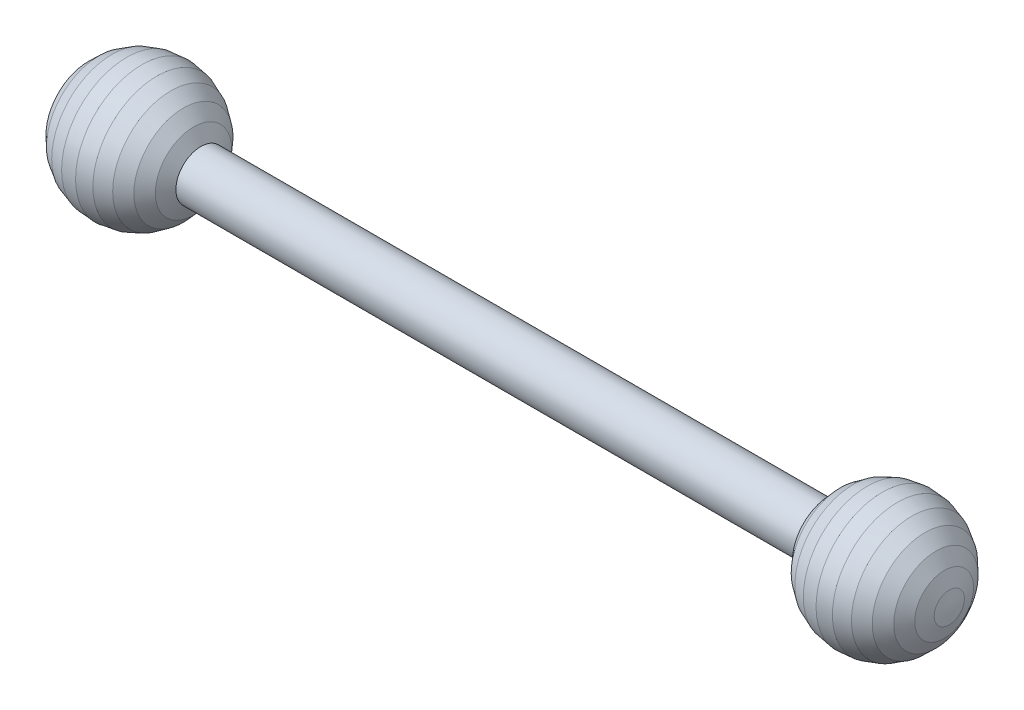
ISO-10303-21;
HEADER;
FILE_DESCRIPTION(('STEP AP214'),'2;1');
FILE_NAME('part.step','',(''),(''),'','','');
FILE_SCHEMA(('AUTOMOTIVE_DESIGN { 1 0 10303 214 1 1 1 1 }'));
ENDSEC;
DATA;
#1=APPLICATION_CONTEXT('core data for automotive mechanical design processes');
#2=APPLICATION_PROTOCOL_DEFINITION('international standard','automotive_design',2000,#1);
#3=PRODUCT_CONTEXT('',#1,'mechanical');
#4=PRODUCT('Part','Part','',(#3));
#5=PRODUCT_RELATED_PRODUCT_CATEGORY('part','',(#4));
#6=PRODUCT_DEFINITION_FORMATION('','',#4);
#7=PRODUCT_DEFINITION_CONTEXT('part definition',#1,'design');
#8=PRODUCT_DEFINITION('design','',#6,#7);
#9=PRODUCT_DEFINITION_SHAPE('','',#8);
#10=(LENGTH_UNIT() NAMED_UNIT(*) SI_UNIT(.MILLI.,.METRE.));
#11=(NAMED_UNIT(*) PLANE_ANGLE_UNIT() SI_UNIT($,.RADIAN.));
#12=(NAMED_UNIT(*) SI_UNIT($,.STERADIAN.) SOLID_ANGLE_UNIT());
#13=UNCERTAINTY_MEASURE_WITH_UNIT(LENGTH_MEASURE(1.E-05),#10,'distance_accuracy_value','');
#14=(GEOMETRIC_REPRESENTATION_CONTEXT(3) GLOBAL_UNCERTAINTY_ASSIGNED_CONTEXT((#13)) GLOBAL_UNIT_ASSIGNED_CONTEXT((#10,
#11,#12)) REPRESENTATION_CONTEXT('',''));
#15=CARTESIAN_POINT('',(0.,0.,0.));
#16=DIRECTION('',(0.,0.,1.));
#17=DIRECTION('',(1.,0.,0.));
#18=AXIS2_PLACEMENT_3D('',#15,#16,#17);
#19=CARTESIAN_POINT('',(-3.89487856586579,0.,0.));
#20=DIRECTION('',(1.,0.,0.));
#21=DIRECTION('',(0.,0.,-1.));
#22=AXIS2_PLACEMENT_3D('',#19,#20,#21);
#23=CONICAL_SURFACE('',#22,0.910999976487176,1.45591316516602);
#24=CARTESIAN_POINT('',(-4.,0.,0.));
#25=VERTEX_POINT('',#24);
#26=VERTEX_LOOP('',#25);
#27=FACE_BOUND('',#26,.T.);
#28=CARTESIAN_POINT('',(-3.89487856586579,0.,0.));
#29=DIRECTION('',(-1.,0.,0.));
#30=DIRECTION('',(0.,0.,1.));
#31=AXIS2_PLACEMENT_3D('',#28,#29,#30);
#32=CIRCLE('',#31,0.910999976487176);
#33=CARTESIAN_POINT('',(-3.89487856586579,0.,0.910999976487176));
#34=VERTEX_POINT('',#33);
#35=EDGE_CURVE('E11',#34,#34,#32,.T.);
#36=ORIENTED_EDGE('',*,*,#35,.T.);
#37=EDGE_LOOP('',(#36));
#38=FACE_BOUND('',#37,.T.);
#39=ADVANCED_FACE('F41',(#27,#38),#23,.T.);
#40=CARTESIAN_POINT('',(-3.5850395214202,0.,0.));
#41=DIRECTION('',(1.,0.,0.));
#42=DIRECTION('',(0.,0.,-1.));
#43=AXIS2_PLACEMENT_3D('',#40,#41,#42);
#44=CONICAL_SURFACE('',#43,1.77411714096205,1.22614684190809);
#45=ORIENTED_EDGE('',*,*,#35,.F.);
#46=EDGE_LOOP('',(#45));
#47=FACE_BOUND('',#46,.T.);
#48=CARTESIAN_POINT('',(-3.5850395214202,0.,0.));
#49=DIRECTION('',(-1.,0.,0.));
#50=DIRECTION('',(0.,0.,1.));
#51=AXIS2_PLACEMENT_3D('',#48,#49,#50);
#52=CIRCLE('',#51,1.77411714096205);
#53=CARTESIAN_POINT('',(-3.5850395214202,0.,1.77411714096205));
#54=VERTEX_POINT('',#53);
#55=EDGE_CURVE('E48',#54,#54,#52,.T.);
#56=ORIENTED_EDGE('',*,*,#55,.T.);
#57=EDGE_LOOP('',(#56));
#58=FACE_BOUND('',#57,.T.);
#59=ADVANCED_FACE('F70',(#47,#58),#44,.T.);
#60=CARTESIAN_POINT('',(-3.08676822901477,0.,0.));
#61=DIRECTION('',(1.,0.,0.));
#62=DIRECTION('',(0.,0.,-1.));
#63=AXIS2_PLACEMENT_3D('',#60,#61,#62);
#64=CONICAL_SURFACE('',#63,2.54398543634687,0.996380518650257);
#65=ORIENTED_EDGE('',*,*,#55,.F.);
#66=EDGE_LOOP('',(#65));
#67=FACE_BOUND('',#66,.T.);
#68=CARTESIAN_POINT('',(-3.08676822901477,0.,0.));
#69=DIRECTION('',(-1.,0.,0.));
#70=DIRECTION('',(0.,0.,1.));
#71=AXIS2_PLACEMENT_3D('',#68,#69,#70);
#72=CIRCLE('',#71,2.54398543634687);
#73=CARTESIAN_POINT('',(-3.08676822901477,0.,2.54398543634687));
#74=VERTEX_POINT('',#73);
#75=EDGE_CURVE('E77',#74,#74,#72,.T.);
#76=ORIENTED_EDGE('',*,*,#75,.T.);
#77=EDGE_LOOP('',(#76));
#78=FACE_BOUND('',#77,.T.);
#79=ADVANCED_FACE('F72',(#67,#78),#64,.T.);
#80=CARTESIAN_POINT('',(-2.42625418507236,0.,0.));
#81=DIRECTION('',(1.,0.,0.));
#82=DIRECTION('',(0.,0.,-1.));
#83=AXIS2_PLACEMENT_3D('',#80,#81,#82);
#84=CONICAL_SURFACE('',#83,3.18014003298896,0.766614195392471);
#85=ORIENTED_EDGE('',*,*,#75,.F.);
#86=EDGE_LOOP('',(#85));
#87=FACE_BOUND('',#86,.T.);
#88=CARTESIAN_POINT('',(-2.42625418507236,0.,0.));
#89=DIRECTION('',(-1.,0.,0.));
#90=DIRECTION('',(0.,0.,1.));
#91=AXIS2_PLACEMENT_3D('',#88,#89,#90);
#92=CIRCLE('',#91,3.18014003298896);
#93=CARTESIAN_POINT('',(-2.42625418507236,0.,3.18014003298896));
#94=VERTEX_POINT('',#93);
#95=EDGE_CURVE('E82',#94,#94,#92,.T.);
#96=ORIENTED_EDGE('',*,*,#95,.T.);
#97=EDGE_LOOP('',(#96));
#98=FACE_BOUND('',#97,.T.);
#99=ADVANCED_FACE('F228',(#87,#98),#84,.T.);
#100=CARTESIAN_POINT('',(-1.63821448137536,0.,0.));
#101=DIRECTION('',(1.,0.,0.));
#102=DIRECTION('',(0.,0.,-1.));
#103=AXIS2_PLACEMENT_3D('',#100,#101,#102);
#104=CONICAL_SURFACE('',#103,3.64914418912327,0.536847872134573);
#105=ORIENTED_EDGE('',*,*,#95,.F.);
#106=EDGE_LOOP('',(#105));
#107=FACE_BOUND('',#106,.T.);
#108=CARTESIAN_POINT('',(-1.63821448137536,0.,0.));
#109=DIRECTION('',(-1.,0.,0.));
#110=DIRECTION('',(0.,0.,1.));
#111=AXIS2_PLACEMENT_3D('',#108,#109,#110);
#112=CIRCLE('',#111,3.64914418912327);
#113=CARTESIAN_POINT('',(-1.63821448137536,0.,3.64914418912327));
#114=VERTEX_POINT('',#113);
#115=EDGE_CURVE('E88',#114,#114,#112,.T.);
#116=ORIENTED_EDGE('',*,*,#115,.T.);
#117=EDGE_LOOP('',(#116));
#118=FACE_BOUND('',#117,.T.);
#119=ADVANCED_FACE('F225',(#107,#118),#104,.T.);
#120=CARTESIAN_POINT('',(-0.764069049827509,0.,0.));
#121=DIRECTION('',(1.,0.,0.));
#122=DIRECTION('',(0.,0.,-1.));
#123=AXIS2_PLACEMENT_3D('',#120,#121,#122);
#124=CONICAL_SURFACE('',#123,3.9263467099959,0.307081548876735);
#125=ORIENTED_EDGE('',*,*,#115,.F.);
#126=EDGE_LOOP('',(#125));
#127=FACE_BOUND('',#126,.T.);
#128=CARTESIAN_POINT('',(-0.764069049827509,0.,0.));
#129=DIRECTION('',(-1.,0.,0.));
#130=DIRECTION('',(0.,0.,1.));
#131=AXIS2_PLACEMENT_3D('',#128,#129,#130);
#132=CIRCLE('',#131,3.9263467099959);
#133=CARTESIAN_POINT('',(-0.764069049827509,0.,3.9263467099959));
#134=VERTEX_POINT('',#133);
#135=EDGE_CURVE('E90',#134,#134,#132,.T.);
#136=ORIENTED_EDGE('',*,*,#135,.T.);
#137=EDGE_LOOP('',(#136));
#138=FACE_BOUND('',#137,.T.);
#139=ADVANCED_FACE('F217',(#127,#138),#124,.T.);
#140=CARTESIAN_POINT('',(0.150236398868131,0.,0.));
#141=DIRECTION('',(1.,0.,0.));
#142=DIRECTION('',(0.,0.,-1.));
#143=AXIS2_PLACEMENT_3D('',#140,#141,#142);
#144=CONICAL_SURFACE('',#143,3.99717763233699,0.0773152256188887);
#145=ORIENTED_EDGE('',*,*,#135,.F.);
#146=EDGE_LOOP('',(#145));
#147=FACE_BOUND('',#146,.T.);
#148=CARTESIAN_POINT('',(0.150236398868131,0.,0.));
#149=DIRECTION('',(-1.,0.,0.));
#150=DIRECTION('',(0.,0.,1.));
#151=AXIS2_PLACEMENT_3D('',#148,#149,#150);
#152=CIRCLE('',#151,3.99717763233699);
#153=CARTESIAN_POINT('',(0.150236398868131,0.,3.99717763233699));
#154=VERTEX_POINT('',#153);
#155=EDGE_CURVE('E95',#154,#154,#152,.T.);
#156=ORIENTED_EDGE('',*,*,#155,.T.);
#157=EDGE_LOOP('',(#156));
#158=FACE_BOUND('',#157,.T.);
#159=ADVANCED_FACE('F212',(#147,#158),#144,.T.);
#160=CARTESIAN_POINT('',(1.05664531470961,0.,0.));
#161=DIRECTION('',(-1.,0.,0.));
#162=DIRECTION('',(0.,0.,1.));
#163=AXIS2_PLACEMENT_3D('',#160,#161,#162);
#164=CONICAL_SURFACE('',#163,3.85791403207776,0.152451097638947);
#165=ORIENTED_EDGE('',*,*,#155,.F.);
#166=EDGE_LOOP('',(#165));
#167=FACE_BOUND('',#166,.T.);
#168=CARTESIAN_POINT('',(1.05664531470961,0.,0.));
#169=DIRECTION('',(-1.,0.,0.));
#170=DIRECTION('',(0.,0.,1.));
#171=AXIS2_PLACEMENT_3D('',#168,#169,#170);
#172=CIRCLE('',#171,3.85791403207776);
#173=CARTESIAN_POINT('',(1.05664531470961,0.,3.85791403207776));
#174=VERTEX_POINT('',#173);
#175=EDGE_CURVE('E92',#174,#174,#172,.T.);
#176=ORIENTED_EDGE('',*,*,#175,.T.);
#177=EDGE_LOOP('',(#176));
#178=FACE_BOUND('',#177,.T.);
#179=ADVANCED_FACE('F209',(#167,#178),#164,.T.);
#180=CARTESIAN_POINT('',(1.9075161951243,0.,0.));
#181=DIRECTION('',(-1.,0.,0.));
#182=DIRECTION('',(0.,0.,1.));
#183=AXIS2_PLACEMENT_3D('',#180,#181,#182);
#184=CONICAL_SURFACE('',#183,3.51587570390917,0.382217420896807);
#185=ORIENTED_EDGE('',*,*,#175,.F.);
#186=EDGE_LOOP('',(#185));
#187=FACE_BOUND('',#186,.T.);
#188=CARTESIAN_POINT('',(1.9075161951243,0.,0.));
#189=DIRECTION('',(-1.,0.,0.));
#190=DIRECTION('',(0.,0.,1.));
#191=AXIS2_PLACEMENT_3D('',#188,#189,#190);
#192=CIRCLE('',#191,3.51587570390917);
#193=CARTESIAN_POINT('',(1.9075161951243,0.,3.51587570390917));
#194=VERTEX_POINT('',#193);
#195=EDGE_CURVE('E98',#194,#194,#192,.T.);
#196=ORIENTED_EDGE('',*,*,#195,.T.);
#197=EDGE_LOOP('',(#196));
#198=FACE_BOUND('',#197,.T.);
#199=ADVANCED_FACE('F206',(#187,#198),#184,.T.);
#200=CARTESIAN_POINT('',(2.658126656506,0.,0.));
#201=DIRECTION('',(-1.,0.,0.));
#202=DIRECTION('',(0.,0.,1.));
#203=AXIS2_PLACEMENT_3D('',#200,#201,#202);
#204=CONICAL_SURFACE('',#203,2.98904042762422,0.611983744154724);
#205=ORIENTED_EDGE('',*,*,#195,.F.);
#206=EDGE_LOOP('',(#205));
#207=FACE_BOUND('',#206,.T.);
#208=CARTESIAN_POINT('',(2.658126656506,0.,0.));
#209=DIRECTION('',(-1.,0.,0.));
#210=DIRECTION('',(0.,0.,1.));
#211=AXIS2_PLACEMENT_3D('',#208,#209,#210);
#212=CIRCLE('',#211,2.98904042762422);
#213=CARTESIAN_POINT('',(2.658126656506,0.,2.98904042762422));
#214=VERTEX_POINT('',#213);
#215=EDGE_CURVE('E101',#214,#214,#212,.T.);
#216=ORIENTED_EDGE('',*,*,#215,.T.);
#217=EDGE_LOOP('',(#216));
#218=FACE_BOUND('',#217,.T.);
#219=ADVANCED_FACE('F205',(#207,#218),#204,.T.);
#220=CARTESIAN_POINT('',(3.26902407476659,0.,0.));
#221=DIRECTION('',(-1.,0.,0.));
#222=DIRECTION('',(0.,0.,1.));
#223=AXIS2_PLACEMENT_3D('',#220,#221,#222);
#224=CONICAL_SURFACE('',#223,2.3050990431207,0.841750067412506);
#225=ORIENTED_EDGE('',*,*,#215,.F.);
#226=EDGE_LOOP('',(#225));
#227=FACE_BOUND('',#226,.T.);
#228=CARTESIAN_POINT('',(3.26902407476659,0.,0.));
#229=DIRECTION('',(-1.,0.,0.));
#230=DIRECTION('',(0.,0.,1.));
#231=AXIS2_PLACEMENT_3D('',#228,#229,#230);
#232=CIRCLE('',#231,2.3050990431207);
#233=CARTESIAN_POINT('',(3.26902407476659,0.,2.3050990431207));
#234=VERTEX_POINT('',#233);
#235=EDGE_CURVE('E102',#234,#234,#232,.T.);
#236=ORIENTED_EDGE('',*,*,#235,.T.);
#237=EDGE_LOOP('',(#236));
#238=FACE_BOUND('',#237,.T.);
#239=ADVANCED_FACE('F196',(#227,#238),#224,.T.);
#240=CARTESIAN_POINT('',(3.70809924354787,0.,0.));
#241=DIRECTION('',(-1.,0.,0.));
#242=DIRECTION('',(0.,0.,1.));
#243=AXIS2_PLACEMENT_3D('',#240,#241,#242);
#244=CONICAL_SURFACE('',#243,1.5,1.07151639067023);
#245=ORIENTED_EDGE('',*,*,#235,.F.);
#246=EDGE_LOOP('',(#245));
#247=FACE_BOUND('',#246,.T.);
#248=CARTESIAN_POINT('',(3.70809924354787,0.,0.));
#249=DIRECTION('',(-1.,0.,0.));
#250=DIRECTION('',(0.,0.,1.));
#251=AXIS2_PLACEMENT_3D('',#248,#249,#250);
#252=CIRCLE('',#251,1.5);
#253=CARTESIAN_POINT('',(3.70809924354787,0.,1.5));
#254=VERTEX_POINT('',#253);
#255=EDGE_CURVE('E110',#254,#254,#252,.T.);
#256=ORIENTED_EDGE('',*,*,#255,.T.);
#257=EDGE_LOOP('',(#256));
#258=FACE_BOUND('',#257,.T.);
#259=ADVANCED_FACE('F194',(#247,#258),#244,.T.);
#260=CARTESIAN_POINT('',(-1000.,0.,0.));
#261=DIRECTION('',(-1.,0.,0.));
#262=DIRECTION('',(0.,0.,1.));
#263=AXIS2_PLACEMENT_3D('',#260,#261,#262);
#264=CYLINDRICAL_SURFACE('',#263,1.5);
#265=ORIENTED_EDGE('',*,*,#255,.F.);
#266=EDGE_LOOP('',(#265));
#267=FACE_BOUND('',#266,.T.);
#268=CARTESIAN_POINT('',(41.2724521092314,0.,0.));
#269=DIRECTION('',(-1.,0.,0.));
#270=DIRECTION('',(0.,0.,1.));
#271=AXIS2_PLACEMENT_3D('',#268,#269,#270);
#272=CIRCLE('',#271,1.5);
#273=CARTESIAN_POINT('',(41.2724521092314,0.,1.5));
#274=VERTEX_POINT('',#273);
#275=EDGE_CURVE('E109',#274,#274,#272,.T.);
#276=ORIENTED_EDGE('',*,*,#275,.T.);
#277=EDGE_LOOP('',(#276));
#278=FACE_BOUND('',#277,.T.);
#279=ADVANCED_FACE('F189',(#267,#278),#264,.T.);
#280=CARTESIAN_POINT('',(41.7115272780124,0.,0.));
#281=DIRECTION('',(1.,0.,0.));
#282=DIRECTION('',(0.,0.,-1.));
#283=AXIS2_PLACEMENT_3D('',#280,#281,#282);
#284=CONICAL_SURFACE('',#283,2.3050990431207,1.07151639067044);
#285=ORIENTED_EDGE('',*,*,#275,.F.);
#286=EDGE_LOOP('',(#285));
#287=FACE_BOUND('',#286,.T.);
#288=CARTESIAN_POINT('',(41.7115272780124,0.,0.));
#289=DIRECTION('',(-1.,0.,0.));
#290=DIRECTION('',(0.,0.,1.));
#291=AXIS2_PLACEMENT_3D('',#288,#289,#290);
#292=CIRCLE('',#291,2.3050990431207);
#293=CARTESIAN_POINT('',(41.7115272780124,0.,2.3050990431207));
#294=VERTEX_POINT('',#293);
#295=EDGE_CURVE('E114',#294,#294,#292,.T.);
#296=ORIENTED_EDGE('',*,*,#295,.T.);
#297=EDGE_LOOP('',(#296));
#298=FACE_BOUND('',#297,.T.);
#299=ADVANCED_FACE('F188',(#287,#298),#284,.T.);
#300=CARTESIAN_POINT('',(42.322424696273,0.,0.));
#301=DIRECTION('',(1.,0.,0.));
#302=DIRECTION('',(0.,0.,-1.));
#303=AXIS2_PLACEMENT_3D('',#300,#301,#302);
#304=CONICAL_SURFACE('',#303,2.98904042762422,0.841750067412506);
#305=ORIENTED_EDGE('',*,*,#295,.F.);
#306=EDGE_LOOP('',(#305));
#307=FACE_BOUND('',#306,.T.);
#308=CARTESIAN_POINT('',(42.322424696273,0.,0.));
#309=DIRECTION('',(-1.,0.,0.));
#310=DIRECTION('',(0.,0.,1.));
#311=AXIS2_PLACEMENT_3D('',#308,#309,#310);
#312=CIRCLE('',#311,2.98904042762422);
#313=CARTESIAN_POINT('',(42.322424696273,0.,2.98904042762422));
#314=VERTEX_POINT('',#313);
#315=EDGE_CURVE('E118',#314,#314,#312,.T.);
#316=ORIENTED_EDGE('',*,*,#315,.T.);
#317=EDGE_LOOP('',(#316));
#318=FACE_BOUND('',#317,.T.);
#319=ADVANCED_FACE('F185',(#307,#318),#304,.T.);
#320=CARTESIAN_POINT('',(43.0730351576549,0.,0.));
#321=DIRECTION('',(1.,0.,0.));
#322=DIRECTION('',(0.,0.,-1.));
#323=AXIS2_PLACEMENT_3D('',#320,#321,#322);
#324=CONICAL_SURFACE('',#323,3.51587570390917,0.611983744154585);
#325=ORIENTED_EDGE('',*,*,#315,.F.);
#326=EDGE_LOOP('',(#325));
#327=FACE_BOUND('',#326,.T.);
#328=CARTESIAN_POINT('',(43.0730351576549,0.,0.));
#329=DIRECTION('',(-1.,0.,0.));
#330=DIRECTION('',(0.,0.,1.));
#331=AXIS2_PLACEMENT_3D('',#328,#329,#330);
#332=CIRCLE('',#331,3.51587570390917);
#333=CARTESIAN_POINT('',(43.0730351576549,0.,3.51587570390917));
#334=VERTEX_POINT('',#333);
#335=EDGE_CURVE('E117',#334,#334,#332,.T.);
#336=ORIENTED_EDGE('',*,*,#335,.T.);
#337=EDGE_LOOP('',(#336));
#338=FACE_BOUND('',#337,.T.);
#339=ADVANCED_FACE('F178',(#327,#338),#324,.T.);
#340=CARTESIAN_POINT('',(43.9239060380696,0.,0.));
#341=DIRECTION('',(1.,0.,0.));
#342=DIRECTION('',(0.,0.,-1.));
#343=AXIS2_PLACEMENT_3D('',#340,#341,#342);
#344=CONICAL_SURFACE('',#343,3.85791403207776,0.382217420896807);
#345=ORIENTED_EDGE('',*,*,#335,.F.);
#346=EDGE_LOOP('',(#345));
#347=FACE_BOUND('',#346,.T.);
#348=CARTESIAN_POINT('',(43.9239060380696,0.,0.));
#349=DIRECTION('',(-1.,0.,0.));
#350=DIRECTION('',(0.,0.,1.));
#351=AXIS2_PLACEMENT_3D('',#348,#349,#350);
#352=CIRCLE('',#351,3.85791403207776);
#353=CARTESIAN_POINT('',(43.9239060380696,0.,3.85791403207776));
#354=VERTEX_POINT('',#353);
#355=EDGE_CURVE('E125',#354,#354,#352,.T.);
#356=ORIENTED_EDGE('',*,*,#355,.T.);
#357=EDGE_LOOP('',(#356));
#358=FACE_BOUND('',#357,.T.);
#359=ADVANCED_FACE('F172',(#347,#358),#344,.T.);
#360=CARTESIAN_POINT('',(44.8303149539111,0.,0.));
#361=DIRECTION('',(1.,0.,0.));
#362=DIRECTION('',(0.,0.,-1.));
#363=AXIS2_PLACEMENT_3D('',#360,#361,#362);
#364=CONICAL_SURFACE('',#363,3.99717763233699,0.152451097638947);
#365=ORIENTED_EDGE('',*,*,#355,.F.);
#366=EDGE_LOOP('',(#365));
#367=FACE_BOUND('',#366,.T.);
#368=CARTESIAN_POINT('',(44.8303149539111,0.,0.));
#369=DIRECTION('',(-1.,0.,0.));
#370=DIRECTION('',(0.,0.,1.));
#371=AXIS2_PLACEMENT_3D('',#368,#369,#370);
#372=CIRCLE('',#371,3.99717763233699);
#373=CARTESIAN_POINT('',(44.8303149539111,0.,3.99717763233699));
#374=VERTEX_POINT('',#373);
#375=EDGE_CURVE('E121',#374,#374,#372,.T.);
#376=ORIENTED_EDGE('',*,*,#375,.T.);
#377=EDGE_LOOP('',(#376));
#378=FACE_BOUND('',#377,.T.);
#379=ADVANCED_FACE('F168',(#367,#378),#364,.T.);
#380=CARTESIAN_POINT('',(45.7446204026066,0.,0.));
#381=DIRECTION('',(-1.,0.,0.));
#382=DIRECTION('',(0.,0.,1.));
#383=AXIS2_PLACEMENT_3D('',#380,#381,#382);
#384=CONICAL_SURFACE('',#383,3.9263467099959,0.0773152256188981);
#385=ORIENTED_EDGE('',*,*,#375,.F.);
#386=EDGE_LOOP('',(#385));
#387=FACE_BOUND('',#386,.T.);
#388=CARTESIAN_POINT('',(45.7446204026066,0.,0.));
#389=DIRECTION('',(-1.,0.,0.));
#390=DIRECTION('',(0.,0.,1.));
#391=AXIS2_PLACEMENT_3D('',#388,#389,#390);
#392=CIRCLE('',#391,3.9263467099959);
#393=CARTESIAN_POINT('',(45.7446204026066,0.,3.9263467099959));
#394=VERTEX_POINT('',#393);
#395=EDGE_CURVE('E126',#394,#394,#392,.T.);
#396=ORIENTED_EDGE('',*,*,#395,.T.);
#397=EDGE_LOOP('',(#396));
#398=FACE_BOUND('',#397,.T.);
#399=ADVANCED_FACE('F167',(#387,#398),#384,.T.);
#400=CARTESIAN_POINT('',(46.6187658341544,0.,0.));
#401=DIRECTION('',(-1.,0.,0.));
#402=DIRECTION('',(0.,0.,1.));
#403=AXIS2_PLACEMENT_3D('',#400,#401,#402);
#404=CONICAL_SURFACE('',#403,3.64914418912327,0.307081548876772);
#405=ORIENTED_EDGE('',*,*,#395,.F.);
#406=EDGE_LOOP('',(#405));
#407=FACE_BOUND('',#406,.T.);
#408=CARTESIAN_POINT('',(46.6187658341544,0.,0.));
#409=DIRECTION('',(-1.,0.,0.));
#410=DIRECTION('',(0.,0.,1.));
#411=AXIS2_PLACEMENT_3D('',#408,#409,#410);
#412=CIRCLE('',#411,3.64914418912327);
#413=CARTESIAN_POINT('',(46.6187658341544,0.,3.64914418912327));
#414=VERTEX_POINT('',#413);
#415=EDGE_CURVE('E133',#414,#414,#412,.T.);
#416=ORIENTED_EDGE('',*,*,#415,.T.);
#417=EDGE_LOOP('',(#416));
#418=FACE_BOUND('',#417,.T.);
#419=ADVANCED_FACE('F165',(#407,#418),#404,.T.);
#420=CARTESIAN_POINT('',(47.4068055378514,0.,0.));
#421=DIRECTION('',(-1.,0.,0.));
#422=DIRECTION('',(0.,0.,1.));
#423=AXIS2_PLACEMENT_3D('',#420,#421,#422);
#424=CONICAL_SURFACE('',#423,3.18014003298896,0.536847872134573);
#425=ORIENTED_EDGE('',*,*,#415,.F.);
#426=EDGE_LOOP('',(#425));
#427=FACE_BOUND('',#426,.T.);
#428=CARTESIAN_POINT('',(47.4068055378514,0.,0.));
#429=DIRECTION('',(-1.,0.,0.));
#430=DIRECTION('',(0.,0.,1.));
#431=AXIS2_PLACEMENT_3D('',#428,#429,#430);
#432=CIRCLE('',#431,3.18014003298896);
#433=CARTESIAN_POINT('',(47.4068055378514,0.,3.18014003298896));
#434=VERTEX_POINT('',#433);
#435=EDGE_CURVE('E132',#434,#434,#432,.T.);
#436=ORIENTED_EDGE('',*,*,#435,.T.);
#437=EDGE_LOOP('',(#436));
#438=FACE_BOUND('',#437,.T.);
#439=ADVANCED_FACE('F154',(#427,#438),#424,.T.);
#440=CARTESIAN_POINT('',(48.067319581794,0.,0.));
#441=DIRECTION('',(-1.,0.,0.));
#442=DIRECTION('',(0.,0.,1.));
#443=AXIS2_PLACEMENT_3D('',#440,#441,#442);
#444=CONICAL_SURFACE('',#443,2.54398543634686,0.766614195392303);
#445=ORIENTED_EDGE('',*,*,#435,.F.);
#446=EDGE_LOOP('',(#445));
#447=FACE_BOUND('',#446,.T.);
#448=CARTESIAN_POINT('',(48.067319581794,0.,0.));
#449=DIRECTION('',(-1.,0.,0.));
#450=DIRECTION('',(0.,0.,1.));
#451=AXIS2_PLACEMENT_3D('',#448,#449,#450);
#452=CIRCLE('',#451,2.54398543634686);
#453=CARTESIAN_POINT('',(48.067319581794,0.,2.54398543634686));
#454=VERTEX_POINT('',#453);
#455=EDGE_CURVE('E140',#454,#454,#452,.T.);
#456=ORIENTED_EDGE('',*,*,#455,.T.);
#457=EDGE_LOOP('',(#456));
#458=FACE_BOUND('',#457,.T.);
#459=ADVANCED_FACE('F149',(#447,#458),#444,.T.);
#460=CARTESIAN_POINT('',(48.5655908741993,0.,0.));
#461=DIRECTION('',(-1.,0.,0.));
#462=DIRECTION('',(0.,0.,1.));
#463=AXIS2_PLACEMENT_3D('',#460,#461,#462);
#464=CONICAL_SURFACE('',#463,1.77411714096204,0.996380518650359);
#465=ORIENTED_EDGE('',*,*,#455,.F.);
#466=EDGE_LOOP('',(#465));
#467=FACE_BOUND('',#466,.T.);
#468=CARTESIAN_POINT('',(48.5655908741993,0.,0.));
#469=DIRECTION('',(-1.,0.,0.));
#470=DIRECTION('',(0.,0.,1.));
#471=AXIS2_PLACEMENT_3D('',#468,#469,#470);
#472=CIRCLE('',#471,1.77411714096204);
#473=CARTESIAN_POINT('',(48.5655908741993,0.,1.77411714096204));
#474=VERTEX_POINT('',#473);
#475=EDGE_CURVE('E136',#474,#474,#472,.T.);
#476=ORIENTED_EDGE('',*,*,#475,.T.);
#477=EDGE_LOOP('',(#476));
#478=FACE_BOUND('',#477,.T.);
#479=ADVANCED_FACE('F65',(#467,#478),#464,.T.);
#480=CARTESIAN_POINT('',(48.8754299186449,0.,0.));
#481=DIRECTION('',(-1.,0.,0.));
#482=DIRECTION('',(0.,0.,1.));
#483=AXIS2_PLACEMENT_3D('',#480,#481,#482);
#484=CONICAL_SURFACE('',#483,0.910999976487175,1.22614684190809);
#485=ORIENTED_EDGE('',*,*,#475,.F.);
#486=EDGE_LOOP('',(#485));
#487=FACE_BOUND('',#486,.T.);
#488=CARTESIAN_POINT('',(48.8754299186449,0.,0.));
#489=DIRECTION('',(-1.,0.,0.));
#490=DIRECTION('',(0.,0.,1.));
#491=AXIS2_PLACEMENT_3D('',#488,#489,#490);
#492=CIRCLE('',#491,0.910999976487175);
#493=CARTESIAN_POINT('',(48.8754299186449,0.,0.910999976487175));
#494=VERTEX_POINT('',#493);
#495=EDGE_CURVE('E141',#494,#494,#492,.T.);
#496=ORIENTED_EDGE('',*,*,#495,.T.);
#497=EDGE_LOOP('',(#496));
#498=FACE_BOUND('',#497,.T.);
#499=ADVANCED_FACE('F57',(#487,#498),#484,.T.);
#500=CARTESIAN_POINT('',(48.9805513527792,0.,0.));
#501=DIRECTION('',(-1.,0.,0.));
#502=DIRECTION('',(0.,0.,1.));
#503=AXIS2_PLACEMENT_3D('',#500,#501,#502);
#504=CONICAL_SURFACE('',#503,1.11022302462516E-13,1.45591316516589);
#505=ORIENTED_EDGE('',*,*,#495,.F.);
#506=EDGE_LOOP('',(#505));
#507=FACE_BOUND('',#506,.T.);
#508=CARTESIAN_POINT('',(48.9805513527791,0.,0.));
#509=VERTEX_POINT('',#508);
#510=VERTEX_LOOP('',#509);
#511=FACE_BOUND('',#510,.T.);
#512=ADVANCED_FACE('F53',(#507,#511),#504,.T.);
#513=CLOSED_SHELL('',(#39,#59,#79,#99,#119,#139,#159,#179,#199,#219,#239,#259,#279,#299,#319,
#339,#359,#379,#399,#419,#439,#459,#479,#499,#512));
#514=MANIFOLD_SOLID_BREP('B2',#513);
#515=ADVANCED_BREP_SHAPE_REPRESENTATION('',(#18,#514),#14);
#516=SHAPE_DEFINITION_REPRESENTATION(#9,#515);
ENDSEC;
END-ISO-10303-21;
